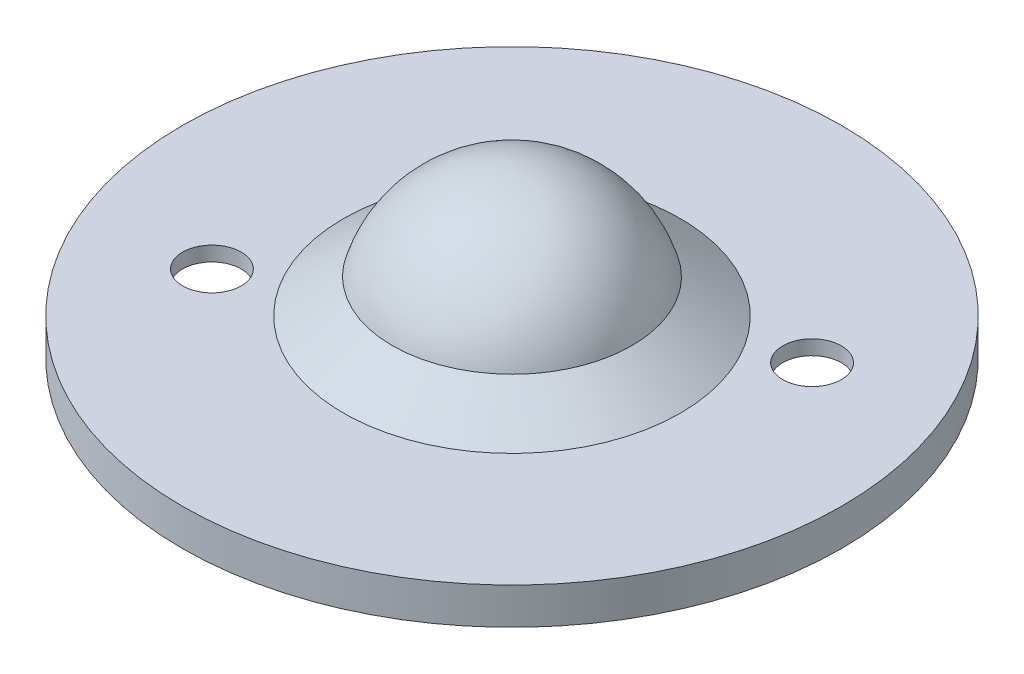
ISO-10303-21;
HEADER;
FILE_DESCRIPTION(('STEP AP214'),'2;1');
FILE_NAME('part.step','',(''),(''),'','','');
FILE_SCHEMA(('AUTOMOTIVE_DESIGN { 1 0 10303 214 1 1 1 1 }'));
ENDSEC;
DATA;
#1=APPLICATION_CONTEXT('core data for automotive mechanical design processes');
#2=APPLICATION_PROTOCOL_DEFINITION('international standard','automotive_design',2000,#1);
#3=PRODUCT_CONTEXT('',#1,'mechanical');
#4=PRODUCT('Part','Part','',(#3));
#5=PRODUCT_RELATED_PRODUCT_CATEGORY('part','',(#4));
#6=PRODUCT_DEFINITION_FORMATION('','',#4);
#7=PRODUCT_DEFINITION_CONTEXT('part definition',#1,'design');
#8=PRODUCT_DEFINITION('design','',#6,#7);
#9=PRODUCT_DEFINITION_SHAPE('','',#8);
#10=(LENGTH_UNIT() NAMED_UNIT(*) SI_UNIT(.MILLI.,.METRE.));
#11=(NAMED_UNIT(*) PLANE_ANGLE_UNIT() SI_UNIT($,.RADIAN.));
#12=(NAMED_UNIT(*) SI_UNIT($,.STERADIAN.) SOLID_ANGLE_UNIT());
#13=UNCERTAINTY_MEASURE_WITH_UNIT(LENGTH_MEASURE(1.E-05),#10,'distance_accuracy_value','');
#14=(GEOMETRIC_REPRESENTATION_CONTEXT(3) GLOBAL_UNCERTAINTY_ASSIGNED_CONTEXT((#13)) GLOBAL_UNIT_ASSIGNED_CONTEXT((#10,
#11,#12)) REPRESENTATION_CONTEXT('',''));
#15=CARTESIAN_POINT('',(0.,0.,0.));
#16=DIRECTION('',(0.,0.,1.));
#17=DIRECTION('',(1.,0.,0.));
#18=AXIS2_PLACEMENT_3D('',#15,#16,#17);
#19=CARTESIAN_POINT('',(0.,0.,0.));
#20=DIRECTION('',(-1.,0.,0.));
#21=DIRECTION('',(0.,1.,0.));
#22=AXIS2_PLACEMENT_3D('',#19,#20,#21);
#23=SPHERICAL_SURFACE('',#22,10.5);
#24=CARTESIAN_POINT('',(0.,-1.81030431730406,0.));
#25=DIRECTION('',(0.,1.,0.));
#26=DIRECTION('',(-1.,0.,0.));
#27=AXIS2_PLACEMENT_3D('',#24,#25,#26);
#28=CIRCLE('',#27,10.3427655043876);
#29=CARTESIAN_POINT('',(-10.3427655043876,-1.81030431730409,0.));
#30=VERTEX_POINT('',#29);
#31=EDGE_CURVE('E49',#30,#30,#28,.T.);
#32=ORIENTED_EDGE('',*,*,#31,.F.);
#33=EDGE_LOOP('',(#32));
#34=FACE_BOUND('',#33,.T.);
#35=ADVANCED_FACE('F45',(#34),#23,.T.);
#36=CARTESIAN_POINT('',(0.,-0.999999999999945,0.));
#37=DIRECTION('',(0.,1.,0.));
#38=DIRECTION('',(-1.,0.,0.));
#39=AXIS2_PLACEMENT_3D('',#36,#37,#38);
#40=CONICAL_SURFACE('',#39,11.5,0.95993108859688);
#41=ORIENTED_EDGE('',*,*,#31,.T.);
#42=EDGE_LOOP('',(#41));
#43=FACE_BOUND('',#42,.T.);
#44=CARTESIAN_POINT('',(0.,-0.999999999999945,0.));
#45=DIRECTION('',(0.,1.,0.));
#46=DIRECTION('',(-1.,0.,0.));
#47=AXIS2_PLACEMENT_3D('',#44,#45,#46);
#48=CIRCLE('',#47,11.5);
#49=CARTESIAN_POINT('',(-11.5,-0.999999999999985,0.));
#50=VERTEX_POINT('',#49);
#51=EDGE_CURVE('E100',#50,#50,#48,.F.);
#52=ORIENTED_EDGE('',*,*,#51,.T.);
#53=EDGE_LOOP('',(#52));
#54=FACE_BOUND('',#53,.T.);
#55=ADVANCED_FACE('F144',(#43,#54),#40,.T.);
#56=CARTESIAN_POINT('',(1.66837462899073E-12,-477.841485340296,0.));
#57=DIRECTION('',(0.,-1.,0.));
#58=DIRECTION('',(1.,0.,0.));
#59=AXIS2_PLACEMENT_3D('',#56,#57,#58);
#60=CYLINDRICAL_SURFACE('',#59,20.499999999952);
#61=CARTESIAN_POINT('',(0.,-0.999999999999945,0.));
#62=DIRECTION('',(0.,-1.,0.));
#63=DIRECTION('',(1.,0.,0.));
#64=AXIS2_PLACEMENT_3D('',#61,#62,#63);
#65=CIRCLE('',#64,20.499999999952);
#66=CARTESIAN_POINT('',(20.499999999952,-0.999999999999874,0.));
#67=VERTEX_POINT('',#66);
#68=EDGE_CURVE('E84',#67,#67,#65,.F.);
#69=ORIENTED_EDGE('',*,*,#68,.T.);
#70=EDGE_LOOP('',(#69));
#71=FACE_BOUND('',#70,.T.);
#72=CARTESIAN_POINT('',(0.,-2.49999999999995,0.));
#73=DIRECTION('',(0.,-1.,0.));
#74=DIRECTION('',(1.,0.,0.));
#75=AXIS2_PLACEMENT_3D('',#72,#73,#74);
#76=CIRCLE('',#75,20.499999999952);
#77=CARTESIAN_POINT('',(20.4999999999521,-2.49999999999988,0.));
#78=VERTEX_POINT('',#77);
#79=EDGE_CURVE('E78',#78,#78,#76,.T.);
#80=ORIENTED_EDGE('',*,*,#79,.T.);
#81=EDGE_LOOP('',(#80));
#82=FACE_BOUND('',#81,.T.);
#83=ADVANCED_FACE('F141',(#71,#82),#60,.F.);
#84=CARTESIAN_POINT('',(-20.499999999952,-1.00000000000002,0.));
#85=DIRECTION('',(0.,1.,0.));
#86=DIRECTION('',(-1.,0.,0.));
#87=AXIS2_PLACEMENT_3D('',#84,#85,#86);
#88=PLANE('',#87);
#89=CARTESIAN_POINT('',(13.0083556961333,-0.9999999999999,-7.4687804950257));
#90=DIRECTION('',(0.,1.,0.));
#91=DIRECTION('',(-1.,0.,0.));
#92=AXIS2_PLACEMENT_3D('',#89,#90,#91);
#93=CIRCLE('',#92,2.);
#94=CARTESIAN_POINT('',(11.0083556961333,-0.999999999999907,-7.4687804950257));
#95=VERTEX_POINT('',#94);
#96=EDGE_CURVE('E108',#95,#95,#93,.F.);
#97=ORIENTED_EDGE('',*,*,#96,.F.);
#98=EDGE_LOOP('',(#97));
#99=FACE_BOUND('',#98,.T.);
#100=CARTESIAN_POINT('',(-13.0083556961333,-0.99999999999999,7.4687804950257));
#101=DIRECTION('',(0.,1.,0.));
#102=DIRECTION('',(-1.,0.,0.));
#103=AXIS2_PLACEMENT_3D('',#100,#101,#102);
#104=CIRCLE('',#103,2.);
#105=CARTESIAN_POINT('',(-15.0083556961333,-0.999999999999997,7.4687804950257));
#106=VERTEX_POINT('',#105);
#107=EDGE_CURVE('E118',#106,#106,#104,.F.);
#108=ORIENTED_EDGE('',*,*,#107,.F.);
#109=EDGE_LOOP('',(#108));
#110=FACE_BOUND('',#109,.T.);
#111=ORIENTED_EDGE('',*,*,#68,.F.);
#112=EDGE_LOOP('',(#111));
#113=FACE_BOUND('',#112,.T.);
#114=ORIENTED_EDGE('',*,*,#51,.F.);
#115=EDGE_LOOP('',(#114));
#116=FACE_BOUND('',#115,.T.);
#117=ADVANCED_FACE('F137',(#99,#110,#113,#116),#88,.F.);
#118=CARTESIAN_POINT('',(-22.499999999952,-2.5,0.));
#119=DIRECTION('',(0.,1.,0.));
#120=DIRECTION('',(-1.,0.,0.));
#121=AXIS2_PLACEMENT_3D('',#118,#119,#120);
#122=PLANE('',#121);
#123=CARTESIAN_POINT('',(0.,-2.49999999999995,0.));
#124=DIRECTION('',(0.,-1.,0.));
#125=DIRECTION('',(1.,0.,0.));
#126=AXIS2_PLACEMENT_3D('',#123,#124,#125);
#127=CIRCLE('',#126,22.499999999976);
#128=CARTESIAN_POINT('',(22.499999999976,-2.49999999999987,0.));
#129=VERTEX_POINT('',#128);
#130=EDGE_CURVE('E83',#129,#129,#127,.F.);
#131=ORIENTED_EDGE('',*,*,#130,.F.);
#132=EDGE_LOOP('',(#131));
#133=FACE_BOUND('',#132,.T.);
#134=ORIENTED_EDGE('',*,*,#79,.F.);
#135=EDGE_LOOP('',(#134));
#136=FACE_BOUND('',#135,.T.);
#137=ADVANCED_FACE('F132',(#133,#136),#122,.F.);
#138=CARTESIAN_POINT('',(0.,0.,0.));
#139=DIRECTION('',(-1.,0.,0.));
#140=DIRECTION('',(0.,1.,0.));
#141=AXIS2_PLACEMENT_3D('',#138,#139,#140);
#142=SPHERICAL_SURFACE('',#141,8.5);
#143=CARTESIAN_POINT('',(0.,2.32824858580777,0.));
#144=DIRECTION('',(0.,-1.,0.));
#145=DIRECTION('',(1.,0.,0.));
#146=AXIS2_PLACEMENT_3D('',#143,#144,#145);
#147=CIRCLE('',#146,8.17491642297853);
#148=CARTESIAN_POINT('',(8.17491642297852,2.3282485858078,0.));
#149=VERTEX_POINT('',#148);
#150=EDGE_CURVE('E63',#149,#149,#147,.T.);
#151=ORIENTED_EDGE('',*,*,#150,.F.);
#152=EDGE_LOOP('',(#151));
#153=FACE_BOUND('',#152,.T.);
#154=ADVANCED_FACE('F127',(#153),#142,.T.);
#155=CARTESIAN_POINT('',(1.66837462899073E-12,-477.841485340296,0.));
#156=DIRECTION('',(0.,-1.,0.));
#157=DIRECTION('',(1.,0.,0.));
#158=AXIS2_PLACEMENT_3D('',#155,#156,#157);
#159=CYLINDRICAL_SURFACE('',#158,22.499999999976);
#160=ORIENTED_EDGE('',*,*,#130,.T.);
#161=EDGE_LOOP('',(#160));
#162=FACE_BOUND('',#161,.T.);
#163=CARTESIAN_POINT('',(0.,0.,0.));
#164=DIRECTION('',(0.,-1.,0.));
#165=DIRECTION('',(1.,0.,0.));
#166=AXIS2_PLACEMENT_3D('',#163,#164,#165);
#167=CIRCLE('',#166,22.499999999976);
#168=CARTESIAN_POINT('',(22.499999999976,1.34069481355145E-13,0.));
#169=VERTEX_POINT('',#168);
#170=EDGE_CURVE('E55',#169,#169,#167,.T.);
#171=ORIENTED_EDGE('',*,*,#170,.T.);
#172=EDGE_LOOP('',(#171));
#173=FACE_BOUND('',#172,.T.);
#174=ADVANCED_FACE('F131',(#162,#173),#159,.T.);
#175=CARTESIAN_POINT('',(0.,0.,0.));
#176=DIRECTION('',(0.,-1.,0.));
#177=DIRECTION('',(1.,0.,0.));
#178=AXIS2_PLACEMENT_3D('',#175,#176,#177);
#179=CONICAL_SURFACE('',#178,11.5,0.959931088596886);
#180=CARTESIAN_POINT('',(0.,0.,0.));
#181=DIRECTION('',(0.,-1.,0.));
#182=DIRECTION('',(1.,0.,0.));
#183=AXIS2_PLACEMENT_3D('',#180,#181,#182);
#184=CIRCLE('',#183,11.5);
#185=CARTESIAN_POINT('',(11.5,0.,0.));
#186=VERTEX_POINT('',#185);
#187=EDGE_CURVE('E11',#186,#186,#184,.F.);
#188=ORIENTED_EDGE('',*,*,#187,.T.);
#189=EDGE_LOOP('',(#188));
#190=FACE_BOUND('',#189,.T.);
#191=ORIENTED_EDGE('',*,*,#150,.T.);
#192=EDGE_LOOP('',(#191));
#193=FACE_BOUND('',#192,.T.);
#194=ADVANCED_FACE('F154',(#190,#193),#179,.T.);
#195=CARTESIAN_POINT('',(-11.5,0.,0.));
#196=DIRECTION('',(0.,-1.,0.));
#197=DIRECTION('',(1.,0.,0.));
#198=AXIS2_PLACEMENT_3D('',#195,#196,#197);
#199=PLANE('',#198);
#200=CARTESIAN_POINT('',(13.0083556961333,0.,-7.4687804950257));
#201=DIRECTION('',(0.,1.,0.));
#202=DIRECTION('',(-1.,0.,0.));
#203=AXIS2_PLACEMENT_3D('',#200,#201,#202);
#204=CIRCLE('',#203,2.);
#205=CARTESIAN_POINT('',(11.0083556961333,0.,-7.4687804950257));
#206=VERTEX_POINT('',#205);
#207=EDGE_CURVE('E113',#206,#206,#204,.T.);
#208=ORIENTED_EDGE('',*,*,#207,.F.);
#209=EDGE_LOOP('',(#208));
#210=FACE_BOUND('',#209,.T.);
#211=CARTESIAN_POINT('',(-13.0083556961333,0.,7.4687804950257));
#212=DIRECTION('',(0.,1.,0.));
#213=DIRECTION('',(-1.,0.,0.));
#214=AXIS2_PLACEMENT_3D('',#211,#212,#213);
#215=CIRCLE('',#214,2.);
#216=CARTESIAN_POINT('',(-15.0083556961333,0.,7.4687804950257));
#217=VERTEX_POINT('',#216);
#218=EDGE_CURVE('E121',#217,#217,#215,.T.);
#219=ORIENTED_EDGE('',*,*,#218,.F.);
#220=EDGE_LOOP('',(#219));
#221=FACE_BOUND('',#220,.T.);
#222=ORIENTED_EDGE('',*,*,#187,.F.);
#223=EDGE_LOOP('',(#222));
#224=FACE_BOUND('',#223,.T.);
#225=ORIENTED_EDGE('',*,*,#170,.F.);
#226=EDGE_LOOP('',(#225));
#227=FACE_BOUND('',#226,.T.);
#228=ADVANCED_FACE('F152',(#210,#221,#224,#227),#199,.F.);
#229=CARTESIAN_POINT('',(-13.0083556961333,-10.5010000000002,7.4687804950257));
#230=DIRECTION('',(0.,1.,0.));
#231=DIRECTION('',(-1.,0.,0.));
#232=AXIS2_PLACEMENT_3D('',#229,#230,#231);
#233=CYLINDRICAL_SURFACE('',#232,2.);
#234=ORIENTED_EDGE('',*,*,#218,.T.);
#235=EDGE_LOOP('',(#234));
#236=FACE_BOUND('',#235,.T.);
#237=ORIENTED_EDGE('',*,*,#107,.T.);
#238=EDGE_LOOP('',(#237));
#239=FACE_BOUND('',#238,.T.);
#240=ADVANCED_FACE('F151',(#236,#239),#233,.F.);
#241=CARTESIAN_POINT('',(13.0083556961333,-10.5010000000001,-7.4687804950257));
#242=DIRECTION('',(0.,1.,0.));
#243=DIRECTION('',(-1.,0.,0.));
#244=AXIS2_PLACEMENT_3D('',#241,#242,#243);
#245=CYLINDRICAL_SURFACE('',#244,2.);
#246=ORIENTED_EDGE('',*,*,#207,.T.);
#247=EDGE_LOOP('',(#246));
#248=FACE_BOUND('',#247,.T.);
#249=ORIENTED_EDGE('',*,*,#96,.T.);
#250=EDGE_LOOP('',(#249));
#251=FACE_BOUND('',#250,.T.);
#252=ADVANCED_FACE('F161',(#248,#251),#245,.F.);
#253=CLOSED_SHELL('',(#35,#55,#83,#117,#137,#154,#174,#194,#228,#240,#252));
#254=MANIFOLD_SOLID_BREP('B2',#253);
#255=ADVANCED_BREP_SHAPE_REPRESENTATION('',(#18,#254),#14);
#256=SHAPE_DEFINITION_REPRESENTATION(#9,#255);
ENDSEC;
END-ISO-10303-21;
